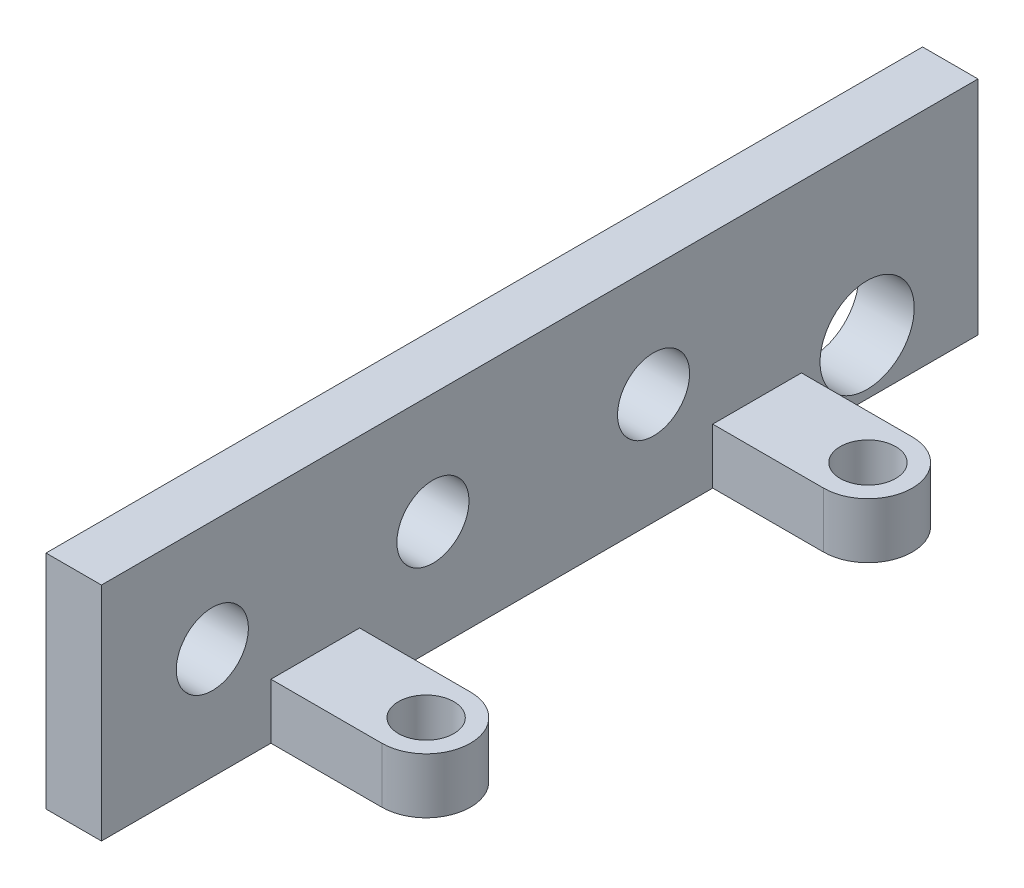
ISO-10303-21;
HEADER;
FILE_DESCRIPTION(('STEP AP214'),'2;1');
FILE_NAME('part.step','',(''),(''),'','','');
FILE_SCHEMA(('AUTOMOTIVE_DESIGN { 1 0 10303 214 1 1 1 1 }'));
ENDSEC;
DATA;
#1=APPLICATION_CONTEXT('core data for automotive mechanical design processes');
#2=APPLICATION_PROTOCOL_DEFINITION('international standard','automotive_design',2000,#1);
#3=PRODUCT_CONTEXT('',#1,'mechanical');
#4=PRODUCT('Part','Part','',(#3));
#5=PRODUCT_RELATED_PRODUCT_CATEGORY('part','',(#4));
#6=PRODUCT_DEFINITION_FORMATION('','',#4);
#7=PRODUCT_DEFINITION_CONTEXT('part definition',#1,'design');
#8=PRODUCT_DEFINITION('design','',#6,#7);
#9=PRODUCT_DEFINITION_SHAPE('','',#8);
#10=(LENGTH_UNIT() NAMED_UNIT(*) SI_UNIT(.MILLI.,.METRE.));
#11=(NAMED_UNIT(*) PLANE_ANGLE_UNIT() SI_UNIT($,.RADIAN.));
#12=(NAMED_UNIT(*) SI_UNIT($,.STERADIAN.) SOLID_ANGLE_UNIT());
#13=UNCERTAINTY_MEASURE_WITH_UNIT(LENGTH_MEASURE(1.E-05),#10,'distance_accuracy_value','');
#14=(GEOMETRIC_REPRESENTATION_CONTEXT(3) GLOBAL_UNCERTAINTY_ASSIGNED_CONTEXT((#13)) GLOBAL_UNIT_ASSIGNED_CONTEXT((#10,
#11,#12)) REPRESENTATION_CONTEXT('',''));
#15=CARTESIAN_POINT('',(0.,0.,0.));
#16=DIRECTION('',(0.,0.,1.));
#17=DIRECTION('',(1.,0.,0.));
#18=AXIS2_PLACEMENT_3D('',#15,#16,#17);
#19=CARTESIAN_POINT('',(-7.17540399088582,8.33972279968538,-0.758910158576653));
#20=DIRECTION('',(1.,0.,0.));
#21=DIRECTION('',(0.,0.,1.));
#22=AXIS2_PLACEMENT_3D('',#19,#20,#21);
#23=PLANE('',#22);
#24=CARTESIAN_POINT('',(-7.17540399088582,13.3397227996854,-69.8205300281515));
#25=DIRECTION('',(-1.,0.,0.));
#26=DIRECTION('',(0.,0.,1.));
#27=AXIS2_PLACEMENT_3D('',#24,#25,#26);
#28=CIRCLE('',#27,4.25000000000001);
#29=CARTESIAN_POINT('',(-7.17540399088582,13.3397227996854,-65.5705300281515));
#30=VERTEX_POINT('',#29);
#31=EDGE_CURVE('E206',#30,#30,#28,.T.);
#32=ORIENTED_EDGE('',*,*,#31,.T.);
#33=EDGE_LOOP('',(#32));
#34=FACE_BOUND('',#33,.T.);
#35=CARTESIAN_POINT('',(-7.17540399088582,18.3397227996854,-30.6589101585767));
#36=DIRECTION('',(-1.,0.,0.));
#37=DIRECTION('',(0.,0.,1.));
#38=AXIS2_PLACEMENT_3D('',#35,#36,#37);
#39=CIRCLE('',#38,3.25);
#40=CARTESIAN_POINT('',(-7.17540399088582,18.3397227996854,-27.4089101585767));
#41=VERTEX_POINT('',#40);
#42=EDGE_CURVE('E218',#41,#41,#39,.T.);
#43=ORIENTED_EDGE('',*,*,#42,.T.);
#44=EDGE_LOOP('',(#43));
#45=FACE_BOUND('',#44,.T.);
#46=CARTESIAN_POINT('',(-7.17540399088582,18.3397227996854,-50.5589101585767));
#47=DIRECTION('',(-1.,0.,0.));
#48=DIRECTION('',(0.,0.,1.));
#49=AXIS2_PLACEMENT_3D('',#46,#47,#48);
#50=CIRCLE('',#49,3.25000000000001);
#51=CARTESIAN_POINT('',(-7.17540399088582,18.3397227996854,-47.3089101585766));
#52=VERTEX_POINT('',#51);
#53=EDGE_CURVE('E212',#52,#52,#50,.T.);
#54=ORIENTED_EDGE('',*,*,#53,.T.);
#55=EDGE_LOOP('',(#54));
#56=FACE_BOUND('',#55,.T.);
#57=CARTESIAN_POINT('',(-7.17540399088582,18.3397227996854,-10.7589101585767));
#58=DIRECTION('',(-1.,0.,0.));
#59=DIRECTION('',(0.,0.,1.));
#60=AXIS2_PLACEMENT_3D('',#57,#58,#59);
#61=CIRCLE('',#60,3.25);
#62=CARTESIAN_POINT('',(-7.17540399088582,18.3397227996854,-7.50891015857665));
#63=VERTEX_POINT('',#62);
#64=EDGE_CURVE('E200',#63,#63,#61,.T.);
#65=ORIENTED_EDGE('',*,*,#64,.T.);
#66=EDGE_LOOP('',(#65));
#67=FACE_BOUND('',#66,.T.);
#68=DIRECTION('',(0.,0.,1.));
#69=VECTOR('',#68,1.);
#70=CARTESIAN_POINT('',(-7.17540399088582,13.3397227996854,-63.8955300281515));
#71=LINE('',#70,#69);
#72=CARTESIAN_POINT('',(-7.17540399088582,13.3397227996854,-63.8955300281515));
#73=VERTEX_POINT('',#72);
#74=CARTESIAN_POINT('',(-7.17540399088582,13.3397227996854,-55.8955300281515));
#75=VERTEX_POINT('',#74);
#76=EDGE_CURVE('E177',#73,#75,#71,.T.);
#77=ORIENTED_EDGE('',*,*,#76,.F.);
#78=DIRECTION('',(0.,1.,0.));
#79=VECTOR('',#78,1.);
#80=CARTESIAN_POINT('',(-7.17540399088582,8.33972279968538,-63.8955300281515));
#81=LINE('',#80,#79);
#82=CARTESIAN_POINT('',(-7.17540399088582,8.33972279968538,-63.8955300281515));
#83=VERTEX_POINT('',#82);
#84=EDGE_CURVE('E174',#83,#73,#81,.T.);
#85=ORIENTED_EDGE('',*,*,#84,.F.);
#86=DIRECTION('',(0.,0.,1.));
#87=VECTOR('',#86,1.);
#88=CARTESIAN_POINT('',(-7.17540399088582,8.33972279968538,-0.758910158576653));
#89=LINE('',#88,#87);
#90=CARTESIAN_POINT('',(-7.17540399088582,8.33972279968537,-79.8205300281515));
#91=VERTEX_POINT('',#90);
#92=EDGE_CURVE('E235',#91,#83,#89,.T.);
#93=ORIENTED_EDGE('',*,*,#92,.F.);
#94=DIRECTION('',(0.,-1.,0.));
#95=VECTOR('',#94,1.);
#96=CARTESIAN_POINT('',(-7.17540399088582,8.33972279968537,-79.8205300281515));
#97=LINE('',#96,#95);
#98=CARTESIAN_POINT('',(-7.17540399088582,28.3397227996854,-79.8205300281515));
#99=VERTEX_POINT('',#98);
#100=EDGE_CURVE('E231',#99,#91,#97,.T.);
#101=ORIENTED_EDGE('',*,*,#100,.F.);
#102=DIRECTION('',(0.,0.,-1.));
#103=VECTOR('',#102,1.);
#104=CARTESIAN_POINT('',(-7.17540399088582,28.3397227996854,-0.758910158576653));
#105=LINE('',#104,#103);
#106=CARTESIAN_POINT('',(-7.17540399088582,28.3397227996854,-0.758910158576653));
#107=VERTEX_POINT('',#106);
#108=EDGE_CURVE('E227',#107,#99,#105,.T.);
#109=ORIENTED_EDGE('',*,*,#108,.F.);
#110=DIRECTION('',(0.,1.,0.));
#111=VECTOR('',#110,1.);
#112=CARTESIAN_POINT('',(-7.17540399088582,8.33972279968538,-0.758910158576653));
#113=LINE('',#112,#111);
#114=CARTESIAN_POINT('',(-7.17540399088582,8.33972279968538,-0.758910158576653));
#115=VERTEX_POINT('',#114);
#116=EDGE_CURVE('E224',#115,#107,#113,.T.);
#117=ORIENTED_EDGE('',*,*,#116,.F.);
#118=CARTESIAN_POINT('',(-7.17540399088582,8.33972279968538,-16.0455300281515));
#119=VERTEX_POINT('',#118);
#120=EDGE_CURVE('E234',#119,#115,#89,.T.);
#121=ORIENTED_EDGE('',*,*,#120,.F.);
#122=DIRECTION('',(0.,1.,0.));
#123=VECTOR('',#122,1.);
#124=CARTESIAN_POINT('',(-7.17540399088582,8.33972279968538,-16.0455300281515));
#125=LINE('',#124,#123);
#126=CARTESIAN_POINT('',(-7.17540399088582,13.3397227996854,-16.0455300281515));
#127=VERTEX_POINT('',#126);
#128=EDGE_CURVE('E180',#119,#127,#125,.T.);
#129=ORIENTED_EDGE('',*,*,#128,.T.);
#130=DIRECTION('',(0.,0.,-1.));
#131=VECTOR('',#130,1.);
#132=CARTESIAN_POINT('',(-7.17540399088582,13.3397227996854,-16.0455300281515));
#133=LINE('',#132,#131);
#134=CARTESIAN_POINT('',(-7.17540399088582,13.3397227996854,-24.0455300281515));
#135=VERTEX_POINT('',#134);
#136=EDGE_CURVE('E195',#127,#135,#133,.T.);
#137=ORIENTED_EDGE('',*,*,#136,.T.);
#138=DIRECTION('',(0.,-1.,0.));
#139=VECTOR('',#138,1.);
#140=CARTESIAN_POINT('',(-7.17540399088582,13.3397227996854,-24.0455300281515));
#141=LINE('',#140,#139);
#142=CARTESIAN_POINT('',(-7.17540399088582,8.33972279968538,-24.0455300281515));
#143=VERTEX_POINT('',#142);
#144=EDGE_CURVE('E146',#135,#143,#141,.T.);
#145=ORIENTED_EDGE('',*,*,#144,.T.);
#146=CARTESIAN_POINT('',(-7.17540399088582,8.33972279968538,-55.8955300281515));
#147=VERTEX_POINT('',#146);
#148=EDGE_CURVE('E239',#147,#143,#89,.T.);
#149=ORIENTED_EDGE('',*,*,#148,.F.);
#150=DIRECTION('',(0.,-1.,0.));
#151=VECTOR('',#150,1.);
#152=CARTESIAN_POINT('',(-7.17540399088582,13.3397227996854,-55.8955300281515));
#153=LINE('',#152,#151);
#154=EDGE_CURVE('E179',#75,#147,#153,.T.);
#155=ORIENTED_EDGE('',*,*,#154,.F.);
#156=EDGE_LOOP('',(#77,#85,#93,#101,#109,#117,#121,#129,#137,#145,#149,#155));
#157=FACE_BOUND('',#156,.T.);
#158=ADVANCED_FACE('F39',(#34,#45,#56,#67,#157),#23,.T.);
#159=CARTESIAN_POINT('',(-12.1754039908858,8.33972279968538,-0.758910158576653));
#160=DIRECTION('',(1.,0.,0.));
#161=DIRECTION('',(0.,0.,1.));
#162=AXIS2_PLACEMENT_3D('',#159,#160,#161);
#163=PLANE('',#162);
#164=DIRECTION('',(0.,1.,0.));
#165=VECTOR('',#164,1.);
#166=CARTESIAN_POINT('',(-12.1754039908858,8.33972279968538,-0.758910158576653));
#167=LINE('',#166,#165);
#168=CARTESIAN_POINT('',(-12.1754039908858,8.33972279968538,-0.758910158576653));
#169=VERTEX_POINT('',#168);
#170=CARTESIAN_POINT('',(-12.1754039908858,28.3397227996854,-0.758910158576653));
#171=VERTEX_POINT('',#170);
#172=EDGE_CURVE('E221',#169,#171,#167,.T.);
#173=ORIENTED_EDGE('',*,*,#172,.T.);
#174=DIRECTION('',(0.,0.,-1.));
#175=VECTOR('',#174,1.);
#176=CARTESIAN_POINT('',(-12.1754039908858,28.3397227996854,-0.758910158576653));
#177=LINE('',#176,#175);
#178=CARTESIAN_POINT('',(-12.1754039908858,28.3397227996854,-79.8205300281515));
#179=VERTEX_POINT('',#178);
#180=EDGE_CURVE('E242',#171,#179,#177,.T.);
#181=ORIENTED_EDGE('',*,*,#180,.T.);
#182=DIRECTION('',(0.,-1.,0.));
#183=VECTOR('',#182,1.);
#184=CARTESIAN_POINT('',(-12.1754039908858,8.33972279968537,-79.8205300281515));
#185=LINE('',#184,#183);
#186=CARTESIAN_POINT('',(-12.1754039908858,8.33972279968537,-79.8205300281515));
#187=VERTEX_POINT('',#186);
#188=EDGE_CURVE('E245',#179,#187,#185,.T.);
#189=ORIENTED_EDGE('',*,*,#188,.T.);
#190=DIRECTION('',(0.,0.,1.));
#191=VECTOR('',#190,1.);
#192=CARTESIAN_POINT('',(-12.1754039908858,8.33972279968538,-0.758910158576653));
#193=LINE('',#192,#191);
#194=EDGE_CURVE('E228',#187,#169,#193,.T.);
#195=ORIENTED_EDGE('',*,*,#194,.T.);
#196=EDGE_LOOP('',(#173,#181,#189,#195));
#197=FACE_BOUND('',#196,.T.);
#198=CARTESIAN_POINT('',(-12.1754039908858,18.3397227996854,-30.6589101585767));
#199=DIRECTION('',(-1.,0.,0.));
#200=DIRECTION('',(0.,0.,1.));
#201=AXIS2_PLACEMENT_3D('',#198,#199,#200);
#202=CIRCLE('',#201,3.25);
#203=CARTESIAN_POINT('',(-12.1754039908858,18.3397227996854,-27.4089101585767));
#204=VERTEX_POINT('',#203);
#205=EDGE_CURVE('E215',#204,#204,#202,.T.);
#206=ORIENTED_EDGE('',*,*,#205,.F.);
#207=EDGE_LOOP('',(#206));
#208=FACE_BOUND('',#207,.T.);
#209=CARTESIAN_POINT('',(-12.1754039908858,18.3397227996854,-50.5589101585767));
#210=DIRECTION('',(-1.,0.,0.));
#211=DIRECTION('',(0.,0.,1.));
#212=AXIS2_PLACEMENT_3D('',#209,#210,#211);
#213=CIRCLE('',#212,3.25000000000001);
#214=CARTESIAN_POINT('',(-12.1754039908858,18.3397227996854,-47.3089101585766));
#215=VERTEX_POINT('',#214);
#216=EDGE_CURVE('E209',#215,#215,#213,.T.);
#217=ORIENTED_EDGE('',*,*,#216,.F.);
#218=EDGE_LOOP('',(#217));
#219=FACE_BOUND('',#218,.T.);
#220=CARTESIAN_POINT('',(-12.1754039908858,13.3397227996854,-69.8205300281515));
#221=DIRECTION('',(-1.,0.,0.));
#222=DIRECTION('',(0.,0.,1.));
#223=AXIS2_PLACEMENT_3D('',#220,#221,#222);
#224=CIRCLE('',#223,4.25000000000001);
#225=CARTESIAN_POINT('',(-12.1754039908858,13.3397227996854,-65.5705300281515));
#226=VERTEX_POINT('',#225);
#227=EDGE_CURVE('E203',#226,#226,#224,.T.);
#228=ORIENTED_EDGE('',*,*,#227,.F.);
#229=EDGE_LOOP('',(#228));
#230=FACE_BOUND('',#229,.T.);
#231=CARTESIAN_POINT('',(-12.1754039908858,18.3397227996854,-10.7589101585767));
#232=DIRECTION('',(-1.,0.,0.));
#233=DIRECTION('',(0.,0.,1.));
#234=AXIS2_PLACEMENT_3D('',#231,#232,#233);
#235=CIRCLE('',#234,3.25);
#236=CARTESIAN_POINT('',(-12.1754039908858,18.3397227996854,-7.50891015857665));
#237=VERTEX_POINT('',#236);
#238=EDGE_CURVE('E185',#237,#237,#235,.T.);
#239=ORIENTED_EDGE('',*,*,#238,.F.);
#240=EDGE_LOOP('',(#239));
#241=FACE_BOUND('',#240,.T.);
#242=ADVANCED_FACE('F262',(#197,#208,#219,#230,#241),#163,.F.);
#243=CARTESIAN_POINT('',(-7.17540399088582,8.33972279968538,-0.758910158576653));
#244=DIRECTION('',(0.,0.,-1.));
#245=DIRECTION('',(1.,0.,0.));
#246=AXIS2_PLACEMENT_3D('',#243,#244,#245);
#247=PLANE('',#246);
#248=ORIENTED_EDGE('',*,*,#172,.F.);
#249=DIRECTION('',(-1.,0.,0.));
#250=VECTOR('',#249,1.);
#251=CARTESIAN_POINT('',(-7.17540399088582,8.33972279968538,-0.758910158576653));
#252=LINE('',#251,#250);
#253=EDGE_CURVE('E238',#115,#169,#252,.T.);
#254=ORIENTED_EDGE('',*,*,#253,.F.);
#255=ORIENTED_EDGE('',*,*,#116,.T.);
#256=DIRECTION('',(-1.,0.,0.));
#257=VECTOR('',#256,1.);
#258=CARTESIAN_POINT('',(-7.17540399088582,28.3397227996854,-0.758910158576653));
#259=LINE('',#258,#257);
#260=EDGE_CURVE('E11',#107,#171,#259,.T.);
#261=ORIENTED_EDGE('',*,*,#260,.T.);
#262=EDGE_LOOP('',(#248,#254,#255,#261));
#263=FACE_BOUND('',#262,.T.);
#264=ADVANCED_FACE('F41',(#263),#247,.F.);
#265=CARTESIAN_POINT('',(-7.17540399088582,28.3397227996854,-0.758910158576653));
#266=DIRECTION('',(0.,-1.,0.));
#267=DIRECTION('',(0.,0.,1.));
#268=AXIS2_PLACEMENT_3D('',#265,#266,#267);
#269=PLANE('',#268);
#270=ORIENTED_EDGE('',*,*,#180,.F.);
#271=ORIENTED_EDGE('',*,*,#260,.F.);
#272=ORIENTED_EDGE('',*,*,#108,.T.);
#273=DIRECTION('',(-1.,0.,0.));
#274=VECTOR('',#273,1.);
#275=CARTESIAN_POINT('',(-7.17540399088582,28.3397227996854,-79.8205300281515));
#276=LINE('',#275,#274);
#277=EDGE_CURVE('E47',#99,#179,#276,.T.);
#278=ORIENTED_EDGE('',*,*,#277,.T.);
#279=EDGE_LOOP('',(#270,#271,#272,#278));
#280=FACE_BOUND('',#279,.T.);
#281=ADVANCED_FACE('F255',(#280),#269,.F.);
#282=CARTESIAN_POINT('',(-7.17540399088582,8.33972279968537,-79.8205300281515));
#283=DIRECTION('',(0.,0.,1.));
#284=DIRECTION('',(-1.,0.,0.));
#285=AXIS2_PLACEMENT_3D('',#282,#283,#284);
#286=PLANE('',#285);
#287=ORIENTED_EDGE('',*,*,#188,.F.);
#288=ORIENTED_EDGE('',*,*,#277,.F.);
#289=ORIENTED_EDGE('',*,*,#100,.T.);
#290=DIRECTION('',(-1.,0.,0.));
#291=VECTOR('',#290,1.);
#292=CARTESIAN_POINT('',(-7.17540399088582,8.33972279968537,-79.8205300281515));
#293=LINE('',#292,#291);
#294=EDGE_CURVE('E251',#91,#187,#293,.T.);
#295=ORIENTED_EDGE('',*,*,#294,.T.);
#296=EDGE_LOOP('',(#287,#288,#289,#295));
#297=FACE_BOUND('',#296,.T.);
#298=ADVANCED_FACE('F259',(#297),#286,.F.);
#299=CARTESIAN_POINT('',(-7.17540399088582,8.33972279968538,-0.758910158576653));
#300=DIRECTION('',(0.,1.,0.));
#301=DIRECTION('',(0.,0.,-1.));
#302=AXIS2_PLACEMENT_3D('',#299,#300,#301);
#303=PLANE('',#302);
#304=CARTESIAN_POINT('',(2.82459600911418,8.33972279968535,-20.0455300281515));
#305=DIRECTION('',(0.,1.,0.));
#306=DIRECTION('',(0.,0.,1.));
#307=AXIS2_PLACEMENT_3D('',#304,#305,#306);
#308=CIRCLE('',#307,2.5);
#309=CARTESIAN_POINT('',(2.82459600911418,8.33972279968535,-17.5455300281515));
#310=VERTEX_POINT('',#309);
#311=EDGE_CURVE('E152',#310,#310,#308,.T.);
#312=ORIENTED_EDGE('',*,*,#311,.T.);
#313=EDGE_LOOP('',(#312));
#314=FACE_BOUND('',#313,.T.);
#315=CARTESIAN_POINT('',(2.82459600911418,8.33972279968536,-59.8955300281515));
#316=DIRECTION('',(0.,-1.,0.));
#317=DIRECTION('',(0.,0.,-1.));
#318=AXIS2_PLACEMENT_3D('',#315,#316,#317);
#319=CIRCLE('',#318,2.5);
#320=CARTESIAN_POINT('',(2.82459600911418,8.33972279968536,-62.3955300281515));
#321=VERTEX_POINT('',#320);
#322=EDGE_CURVE('E161',#321,#321,#319,.T.);
#323=ORIENTED_EDGE('',*,*,#322,.F.);
#324=EDGE_LOOP('',(#323));
#325=FACE_BOUND('',#324,.T.);
#326=ORIENTED_EDGE('',*,*,#194,.F.);
#327=ORIENTED_EDGE('',*,*,#294,.F.);
#328=ORIENTED_EDGE('',*,*,#92,.T.);
#329=DIRECTION('',(-1.,0.,0.));
#330=VECTOR('',#329,1.);
#331=CARTESIAN_POINT('',(2.82459600911418,8.33972279968538,-63.8955300281515));
#332=LINE('',#331,#330);
#333=CARTESIAN_POINT('',(2.82459600911418,8.33972279968538,-63.8955300281515));
#334=VERTEX_POINT('',#333);
#335=EDGE_CURVE('E186',#334,#83,#332,.T.);
#336=ORIENTED_EDGE('',*,*,#335,.F.);
#337=CARTESIAN_POINT('',(2.82459600911418,8.33972279968538,-59.8955300281515));
#338=DIRECTION('',(0.,1.,0.));
#339=DIRECTION('',(0.,0.,1.));
#340=AXIS2_PLACEMENT_3D('',#337,#338,#339);
#341=CIRCLE('',#340,4.);
#342=CARTESIAN_POINT('',(2.82459600911418,8.33972279968538,-55.8955300281515));
#343=VERTEX_POINT('',#342);
#344=EDGE_CURVE('E167',#343,#334,#341,.T.);
#345=ORIENTED_EDGE('',*,*,#344,.F.);
#346=DIRECTION('',(-1.,0.,0.));
#347=VECTOR('',#346,1.);
#348=CARTESIAN_POINT('',(2.82459600911418,8.33972279968538,-55.8955300281515));
#349=LINE('',#348,#347);
#350=EDGE_CURVE('E188',#343,#147,#349,.T.);
#351=ORIENTED_EDGE('',*,*,#350,.T.);
#352=ORIENTED_EDGE('',*,*,#148,.T.);
#353=DIRECTION('',(-1.,0.,0.));
#354=VECTOR('',#353,1.);
#355=CARTESIAN_POINT('',(2.82459600911418,8.33972279968538,-24.0455300281515));
#356=LINE('',#355,#354);
#357=CARTESIAN_POINT('',(2.82459600911418,8.33972279968538,-24.0455300281515));
#358=VERTEX_POINT('',#357);
#359=EDGE_CURVE('E149',#358,#143,#356,.T.);
#360=ORIENTED_EDGE('',*,*,#359,.F.);
#361=CARTESIAN_POINT('',(2.82459600911418,8.33972279968538,-20.0455300281515));
#362=DIRECTION('',(0.,-1.,0.));
#363=DIRECTION('',(0.,0.,-1.));
#364=AXIS2_PLACEMENT_3D('',#361,#362,#363);
#365=CIRCLE('',#364,4.);
#366=CARTESIAN_POINT('',(2.82459600911418,8.33972279968538,-16.0455300281515));
#367=VERTEX_POINT('',#366);
#368=EDGE_CURVE('E136',#358,#367,#365,.T.);
#369=ORIENTED_EDGE('',*,*,#368,.T.);
#370=DIRECTION('',(-1.,0.,0.));
#371=VECTOR('',#370,1.);
#372=CARTESIAN_POINT('',(2.82459600911418,8.33972279968538,-16.0455300281515));
#373=LINE('',#372,#371);
#374=EDGE_CURVE('E140',#367,#119,#373,.T.);
#375=ORIENTED_EDGE('',*,*,#374,.T.);
#376=ORIENTED_EDGE('',*,*,#120,.T.);
#377=ORIENTED_EDGE('',*,*,#253,.T.);
#378=EDGE_LOOP('',(#326,#327,#328,#336,#345,#351,#352,#360,#369,#375,#376,#377));
#379=FACE_BOUND('',#378,.T.);
#380=ADVANCED_FACE('F275',(#314,#325,#379),#303,.F.);
#381=CARTESIAN_POINT('',(-7.17540399088582,18.3397227996854,-30.6589101585767));
#382=DIRECTION('',(-1.,0.,0.));
#383=DIRECTION('',(0.,0.,-1.));
#384=AXIS2_PLACEMENT_3D('',#381,#382,#383);
#385=CYLINDRICAL_SURFACE('',#384,3.25);
#386=ORIENTED_EDGE('',*,*,#42,.F.);
#387=EDGE_LOOP('',(#386));
#388=FACE_BOUND('',#387,.T.);
#389=ORIENTED_EDGE('',*,*,#205,.T.);
#390=EDGE_LOOP('',(#389));
#391=FACE_BOUND('',#390,.T.);
#392=ADVANCED_FACE('F305',(#388,#391),#385,.F.);
#393=CARTESIAN_POINT('',(-7.17540399088582,18.3397227996854,-50.5589101585767));
#394=DIRECTION('',(-1.,0.,0.));
#395=DIRECTION('',(0.,0.,-1.));
#396=AXIS2_PLACEMENT_3D('',#393,#394,#395);
#397=CYLINDRICAL_SURFACE('',#396,3.25000000000001);
#398=ORIENTED_EDGE('',*,*,#53,.F.);
#399=EDGE_LOOP('',(#398));
#400=FACE_BOUND('',#399,.T.);
#401=ORIENTED_EDGE('',*,*,#216,.T.);
#402=EDGE_LOOP('',(#401));
#403=FACE_BOUND('',#402,.T.);
#404=ADVANCED_FACE('F443',(#400,#403),#397,.F.);
#405=CARTESIAN_POINT('',(-7.17540399088582,13.3397227996854,-69.8205300281515));
#406=DIRECTION('',(-1.,0.,0.));
#407=DIRECTION('',(0.,0.,-1.));
#408=AXIS2_PLACEMENT_3D('',#405,#406,#407);
#409=CYLINDRICAL_SURFACE('',#408,4.25000000000001);
#410=ORIENTED_EDGE('',*,*,#31,.F.);
#411=EDGE_LOOP('',(#410));
#412=FACE_BOUND('',#411,.T.);
#413=ORIENTED_EDGE('',*,*,#227,.T.);
#414=EDGE_LOOP('',(#413));
#415=FACE_BOUND('',#414,.T.);
#416=ADVANCED_FACE('F292',(#412,#415),#409,.F.);
#417=CARTESIAN_POINT('',(-7.17540399088582,18.3397227996854,-10.7589101585767));
#418=DIRECTION('',(-1.,0.,0.));
#419=DIRECTION('',(0.,0.,-1.));
#420=AXIS2_PLACEMENT_3D('',#417,#418,#419);
#421=CYLINDRICAL_SURFACE('',#420,3.25);
#422=ORIENTED_EDGE('',*,*,#64,.F.);
#423=EDGE_LOOP('',(#422));
#424=FACE_BOUND('',#423,.T.);
#425=ORIENTED_EDGE('',*,*,#238,.T.);
#426=EDGE_LOOP('',(#425));
#427=FACE_BOUND('',#426,.T.);
#428=ADVANCED_FACE('F284',(#424,#427),#421,.F.);
#429=CARTESIAN_POINT('',(2.82459600911418,8.33972279968538,-16.0455300281515));
#430=DIRECTION('',(0.,0.,-1.));
#431=DIRECTION('',(1.,0.,0.));
#432=AXIS2_PLACEMENT_3D('',#429,#430,#431);
#433=PLANE('',#432);
#434=ORIENTED_EDGE('',*,*,#128,.F.);
#435=ORIENTED_EDGE('',*,*,#374,.F.);
#436=DIRECTION('',(0.,1.,0.));
#437=VECTOR('',#436,1.);
#438=CARTESIAN_POINT('',(2.82459600911418,8.33972279968538,-16.0455300281515));
#439=LINE('',#438,#437);
#440=CARTESIAN_POINT('',(2.82459600911418,13.3397227996854,-16.0455300281515));
#441=VERTEX_POINT('',#440);
#442=EDGE_CURVE('E139',#367,#441,#439,.T.);
#443=ORIENTED_EDGE('',*,*,#442,.T.);
#444=DIRECTION('',(-1.,0.,0.));
#445=VECTOR('',#444,1.);
#446=CARTESIAN_POINT('',(2.82459600911418,13.3397227996854,-16.0455300281515));
#447=LINE('',#446,#445);
#448=EDGE_CURVE('E62',#441,#127,#447,.T.);
#449=ORIENTED_EDGE('',*,*,#448,.T.);
#450=EDGE_LOOP('',(#434,#435,#443,#449));
#451=FACE_BOUND('',#450,.T.);
#452=ADVANCED_FACE('F282',(#451),#433,.F.);
#453=CARTESIAN_POINT('',(2.82459600911418,13.3397227996854,-16.0455300281515));
#454=DIRECTION('',(0.,-1.,0.));
#455=DIRECTION('',(0.,0.,1.));
#456=AXIS2_PLACEMENT_3D('',#453,#454,#455);
#457=PLANE('',#456);
#458=CARTESIAN_POINT('',(2.82459600911418,13.3397227996854,-20.0455300281515));
#459=DIRECTION('',(0.,1.,0.));
#460=DIRECTION('',(0.,0.,1.));
#461=AXIS2_PLACEMENT_3D('',#458,#459,#460);
#462=CIRCLE('',#461,2.5);
#463=CARTESIAN_POINT('',(2.82459600911418,13.3397227996854,-17.5455300281515));
#464=VERTEX_POINT('',#463);
#465=EDGE_CURVE('E157',#464,#464,#462,.T.);
#466=ORIENTED_EDGE('',*,*,#465,.F.);
#467=EDGE_LOOP('',(#466));
#468=FACE_BOUND('',#467,.T.);
#469=ORIENTED_EDGE('',*,*,#136,.F.);
#470=ORIENTED_EDGE('',*,*,#448,.F.);
#471=CARTESIAN_POINT('',(2.82459600911418,13.3397227996854,-20.0455300281515));
#472=DIRECTION('',(0.,-1.,0.));
#473=DIRECTION('',(0.,0.,-1.));
#474=AXIS2_PLACEMENT_3D('',#471,#472,#473);
#475=CIRCLE('',#474,4.);
#476=CARTESIAN_POINT('',(2.82459600911418,13.3397227996854,-24.0455300281515));
#477=VERTEX_POINT('',#476);
#478=EDGE_CURVE('E134',#477,#441,#475,.T.);
#479=ORIENTED_EDGE('',*,*,#478,.F.);
#480=DIRECTION('',(-1.,0.,0.));
#481=VECTOR('',#480,1.);
#482=CARTESIAN_POINT('',(2.82459600911418,13.3397227996854,-24.0455300281515));
#483=LINE('',#482,#481);
#484=EDGE_CURVE('E143',#477,#135,#483,.T.);
#485=ORIENTED_EDGE('',*,*,#484,.T.);
#486=EDGE_LOOP('',(#469,#470,#479,#485));
#487=FACE_BOUND('',#486,.T.);
#488=ADVANCED_FACE('F151',(#468,#487),#457,.F.);
#489=CARTESIAN_POINT('',(2.82459600911418,13.3397227996854,-24.0455300281515));
#490=DIRECTION('',(0.,0.,1.));
#491=DIRECTION('',(-1.,0.,0.));
#492=AXIS2_PLACEMENT_3D('',#489,#490,#491);
#493=PLANE('',#492);
#494=ORIENTED_EDGE('',*,*,#144,.F.);
#495=ORIENTED_EDGE('',*,*,#484,.F.);
#496=DIRECTION('',(0.,-1.,0.));
#497=VECTOR('',#496,1.);
#498=CARTESIAN_POINT('',(2.82459600911418,13.3397227996854,-24.0455300281515));
#499=LINE('',#498,#497);
#500=EDGE_CURVE('E130',#477,#358,#499,.T.);
#501=ORIENTED_EDGE('',*,*,#500,.T.);
#502=ORIENTED_EDGE('',*,*,#359,.T.);
#503=EDGE_LOOP('',(#494,#495,#501,#502));
#504=FACE_BOUND('',#503,.T.);
#505=ADVANCED_FACE('F144',(#504),#493,.F.);
#506=CARTESIAN_POINT('',(2.82459600911418,13.3397227996854,-63.8955300281515));
#507=DIRECTION('',(0.,1.,0.));
#508=DIRECTION('',(0.,0.,-1.));
#509=AXIS2_PLACEMENT_3D('',#506,#507,#508);
#510=PLANE('',#509);
#511=CARTESIAN_POINT('',(2.82459600911418,13.3397227996854,-59.8955300281515));
#512=DIRECTION('',(0.,-1.,0.));
#513=DIRECTION('',(0.,0.,-1.));
#514=AXIS2_PLACEMENT_3D('',#511,#512,#513);
#515=CIRCLE('',#514,2.5);
#516=CARTESIAN_POINT('',(2.82459600911418,13.3397227996854,-62.3955300281515));
#517=VERTEX_POINT('',#516);
#518=EDGE_CURVE('E154',#517,#517,#515,.T.);
#519=ORIENTED_EDGE('',*,*,#518,.T.);
#520=EDGE_LOOP('',(#519));
#521=FACE_BOUND('',#520,.T.);
#522=ORIENTED_EDGE('',*,*,#76,.T.);
#523=DIRECTION('',(-1.,0.,0.));
#524=VECTOR('',#523,1.);
#525=CARTESIAN_POINT('',(2.82459600911418,13.3397227996854,-55.8955300281515));
#526=LINE('',#525,#524);
#527=CARTESIAN_POINT('',(2.82459600911418,13.3397227996854,-55.8955300281515));
#528=VERTEX_POINT('',#527);
#529=EDGE_CURVE('E176',#528,#75,#526,.T.);
#530=ORIENTED_EDGE('',*,*,#529,.F.);
#531=CARTESIAN_POINT('',(2.82459600911418,13.3397227996854,-59.8955300281515));
#532=DIRECTION('',(0.,1.,0.));
#533=DIRECTION('',(0.,0.,1.));
#534=AXIS2_PLACEMENT_3D('',#531,#532,#533);
#535=CIRCLE('',#534,4.);
#536=CARTESIAN_POINT('',(2.82459600911418,13.3397227996854,-63.8955300281515));
#537=VERTEX_POINT('',#536);
#538=EDGE_CURVE('E164',#528,#537,#535,.T.);
#539=ORIENTED_EDGE('',*,*,#538,.T.);
#540=DIRECTION('',(-1.,0.,0.));
#541=VECTOR('',#540,1.);
#542=CARTESIAN_POINT('',(2.82459600911418,13.3397227996854,-63.8955300281515));
#543=LINE('',#542,#541);
#544=EDGE_CURVE('E54',#537,#73,#543,.T.);
#545=ORIENTED_EDGE('',*,*,#544,.T.);
#546=EDGE_LOOP('',(#522,#530,#539,#545));
#547=FACE_BOUND('',#546,.T.);
#548=ADVANCED_FACE('F357',(#521,#547),#510,.T.);
#549=CARTESIAN_POINT('',(2.82459600911418,8.33972279968538,-63.8955300281515));
#550=DIRECTION('',(0.,0.,-1.));
#551=DIRECTION('',(1.,0.,0.));
#552=AXIS2_PLACEMENT_3D('',#549,#550,#551);
#553=PLANE('',#552);
#554=ORIENTED_EDGE('',*,*,#84,.T.);
#555=ORIENTED_EDGE('',*,*,#544,.F.);
#556=DIRECTION('',(0.,1.,0.));
#557=VECTOR('',#556,1.);
#558=CARTESIAN_POINT('',(2.82459600911418,8.33972279968538,-63.8955300281515));
#559=LINE('',#558,#557);
#560=EDGE_CURVE('E173',#334,#537,#559,.T.);
#561=ORIENTED_EDGE('',*,*,#560,.F.);
#562=ORIENTED_EDGE('',*,*,#335,.T.);
#563=EDGE_LOOP('',(#554,#555,#561,#562));
#564=FACE_BOUND('',#563,.T.);
#565=ADVANCED_FACE('F367',(#564),#553,.T.);
#566=CARTESIAN_POINT('',(2.82459600911418,13.3397227996854,-55.8955300281515));
#567=DIRECTION('',(0.,0.,1.));
#568=DIRECTION('',(-1.,0.,0.));
#569=AXIS2_PLACEMENT_3D('',#566,#567,#568);
#570=PLANE('',#569);
#571=ORIENTED_EDGE('',*,*,#154,.T.);
#572=ORIENTED_EDGE('',*,*,#350,.F.);
#573=DIRECTION('',(0.,-1.,0.));
#574=VECTOR('',#573,1.);
#575=CARTESIAN_POINT('',(2.82459600911418,13.3397227996854,-55.8955300281515));
#576=LINE('',#575,#574);
#577=EDGE_CURVE('E171',#528,#343,#576,.T.);
#578=ORIENTED_EDGE('',*,*,#577,.F.);
#579=ORIENTED_EDGE('',*,*,#529,.T.);
#580=EDGE_LOOP('',(#571,#572,#578,#579));
#581=FACE_BOUND('',#580,.T.);
#582=ADVANCED_FACE('F379',(#581),#570,.T.);
#583=CARTESIAN_POINT('',(2.82459600911418,8.33972279968538,-59.8955300281515));
#584=DIRECTION('',(0.,1.,0.));
#585=DIRECTION('',(0.,0.,-1.));
#586=AXIS2_PLACEMENT_3D('',#583,#584,#585);
#587=CYLINDRICAL_SURFACE('',#586,4.);
#588=ORIENTED_EDGE('',*,*,#538,.F.);
#589=ORIENTED_EDGE('',*,*,#577,.T.);
#590=ORIENTED_EDGE('',*,*,#344,.T.);
#591=ORIENTED_EDGE('',*,*,#560,.T.);
#592=EDGE_LOOP('',(#588,#589,#590,#591));
#593=FACE_BOUND('',#592,.T.);
#594=ADVANCED_FACE('F389',(#593),#587,.T.);
#595=CARTESIAN_POINT('',(2.82459600911418,8.33972279968536,-59.8955300281515));
#596=DIRECTION('',(0.,1.,0.));
#597=DIRECTION('',(0.,0.,-1.));
#598=AXIS2_PLACEMENT_3D('',#595,#596,#597);
#599=CYLINDRICAL_SURFACE('',#598,2.5);
#600=ORIENTED_EDGE('',*,*,#322,.T.);
#601=EDGE_LOOP('',(#600));
#602=FACE_BOUND('',#601,.T.);
#603=ORIENTED_EDGE('',*,*,#518,.F.);
#604=EDGE_LOOP('',(#603));
#605=FACE_BOUND('',#604,.T.);
#606=ADVANCED_FACE('F399',(#602,#605),#599,.F.);
#607=CARTESIAN_POINT('',(2.82459600911418,8.33972279968538,-20.0455300281515));
#608=DIRECTION('',(0.,1.,0.));
#609=DIRECTION('',(0.,0.,-1.));
#610=AXIS2_PLACEMENT_3D('',#607,#608,#609);
#611=CYLINDRICAL_SURFACE('',#610,4.);
#612=ORIENTED_EDGE('',*,*,#478,.T.);
#613=ORIENTED_EDGE('',*,*,#442,.F.);
#614=ORIENTED_EDGE('',*,*,#368,.F.);
#615=ORIENTED_EDGE('',*,*,#500,.F.);
#616=EDGE_LOOP('',(#612,#613,#614,#615));
#617=FACE_BOUND('',#616,.T.);
#618=ADVANCED_FACE('F132',(#617),#611,.T.);
#619=CARTESIAN_POINT('',(2.82459600911418,8.33972279968535,-20.0455300281515));
#620=DIRECTION('',(0.,1.,0.));
#621=DIRECTION('',(0.,0.,-1.));
#622=AXIS2_PLACEMENT_3D('',#619,#620,#621);
#623=CYLINDRICAL_SURFACE('',#622,2.5);
#624=ORIENTED_EDGE('',*,*,#311,.F.);
#625=EDGE_LOOP('',(#624));
#626=FACE_BOUND('',#625,.T.);
#627=ORIENTED_EDGE('',*,*,#465,.T.);
#628=EDGE_LOOP('',(#627));
#629=FACE_BOUND('',#628,.T.);
#630=ADVANCED_FACE('F418',(#626,#629),#623,.F.);
#631=CLOSED_SHELL('',(#158,#242,#264,#281,#298,#380,#392,#404,#416,#428,#452,#488,#505,#548,
#565,#582,#594,#606,#618,#630));
#632=MANIFOLD_SOLID_BREP('B2',#631);
#633=ADVANCED_BREP_SHAPE_REPRESENTATION('',(#18,#632),#14);
#634=SHAPE_DEFINITION_REPRESENTATION(#9,#633);
ENDSEC;
END-ISO-10303-21;
